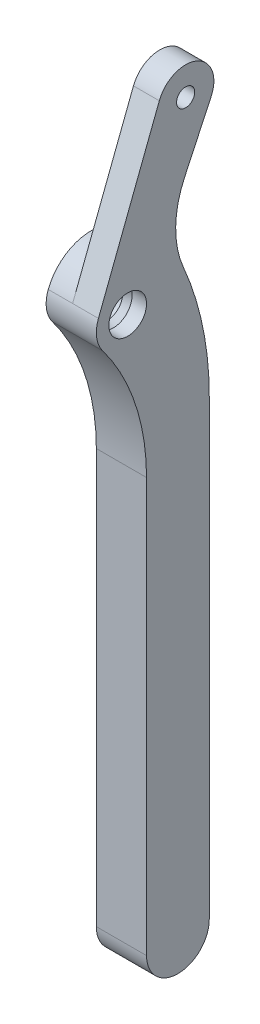
ISO-10303-21;
HEADER;
FILE_DESCRIPTION(('STEP AP214'),'2;1');
FILE_NAME('part.step','',(''),(''),'','','');
FILE_SCHEMA(('AUTOMOTIVE_DESIGN { 1 0 10303 214 1 1 1 1 }'));
ENDSEC;
DATA;
#1=APPLICATION_CONTEXT('core data for automotive mechanical design processes');
#2=APPLICATION_PROTOCOL_DEFINITION('international standard','automotive_design',2000,#1);
#3=PRODUCT_CONTEXT('',#1,'mechanical');
#4=PRODUCT('Part','Part','',(#3));
#5=PRODUCT_RELATED_PRODUCT_CATEGORY('part','',(#4));
#6=PRODUCT_DEFINITION_FORMATION('','',#4);
#7=PRODUCT_DEFINITION_CONTEXT('part definition',#1,'design');
#8=PRODUCT_DEFINITION('design','',#6,#7);
#9=PRODUCT_DEFINITION_SHAPE('','',#8);
#10=(LENGTH_UNIT() NAMED_UNIT(*) SI_UNIT(.MILLI.,.METRE.));
#11=(NAMED_UNIT(*) PLANE_ANGLE_UNIT() SI_UNIT($,.RADIAN.));
#12=(NAMED_UNIT(*) SI_UNIT($,.STERADIAN.) SOLID_ANGLE_UNIT());
#13=UNCERTAINTY_MEASURE_WITH_UNIT(LENGTH_MEASURE(1.E-05),#10,'distance_accuracy_value','');
#14=(GEOMETRIC_REPRESENTATION_CONTEXT(3) GLOBAL_UNCERTAINTY_ASSIGNED_CONTEXT((#13)) GLOBAL_UNIT_ASSIGNED_CONTEXT((#10,
#11,#12)) REPRESENTATION_CONTEXT('',''));
#15=CARTESIAN_POINT('',(0.,0.,0.));
#16=DIRECTION('',(0.,0.,1.));
#17=DIRECTION('',(1.,0.,0.));
#18=AXIS2_PLACEMENT_3D('',#15,#16,#17);
#19=CARTESIAN_POINT('',(-4.,0.,0.));
#20=DIRECTION('',(1.,0.,0.));
#21=DIRECTION('',(0.,0.,-1.));
#22=AXIS2_PLACEMENT_3D('',#19,#20,#21);
#23=PLANE('',#22);
#24=CARTESIAN_POINT('',(-4.,0.,0.));
#25=DIRECTION('',(1.,0.,0.));
#26=DIRECTION('',(0.,0.,-1.));
#27=AXIS2_PLACEMENT_3D('',#24,#25,#26);
#28=CIRCLE('',#27,3.);
#29=CARTESIAN_POINT('',(-4.,0.,-3.));
#30=VERTEX_POINT('',#29);
#31=EDGE_CURVE('E186',#30,#30,#28,.T.);
#32=ORIENTED_EDGE('',*,*,#31,.T.);
#33=EDGE_LOOP('',(#32));
#34=FACE_BOUND('',#33,.T.);
#35=CARTESIAN_POINT('',(-4.,-0.833359515232359,-2.16407586191516));
#36=DIRECTION('',(1.,0.,0.));
#37=DIRECTION('',(0.,0.,-1.));
#38=AXIS2_PLACEMENT_3D('',#35,#36,#37);
#39=CIRCLE('',#38,7.31898952514929);
#40=CARTESIAN_POINT('',(-4.,2.07598321337337,-8.87997733206451));
#41=VERTEX_POINT('',#40);
#42=CARTESIAN_POINT('',(-4.,1.79681604033703,4.66598886809512));
#43=VERTEX_POINT('',#42);
#44=EDGE_CURVE('E193',#41,#43,#39,.T.);
#45=ORIENTED_EDGE('',*,*,#44,.F.);
#46=CARTESIAN_POINT('',(-4.,-17.7993200549858,37.));
#47=DIRECTION('',(1.,0.,0.));
#48=DIRECTION('',(0.,0.,-1.));
#49=AXIS2_PLACEMENT_3D('',#46,#47,#48);
#50=CIRCLE('',#49,50.);
#51=CARTESIAN_POINT('',(-4.,-17.7993200549858,-13.));
#52=VERTEX_POINT('',#51);
#53=EDGE_CURVE('E155',#52,#41,#50,.T.);
#54=ORIENTED_EDGE('',*,*,#53,.F.);
#55=DIRECTION('',(0.,1.,0.));
#56=VECTOR('',#55,1.);
#57=CARTESIAN_POINT('',(-4.,0.,-13.));
#58=LINE('',#57,#56);
#59=CARTESIAN_POINT('',(-4.,-90.,-13.));
#60=VERTEX_POINT('',#59);
#61=EDGE_CURVE('E76',#60,#52,#58,.T.);
#62=ORIENTED_EDGE('',*,*,#61,.F.);
#63=CARTESIAN_POINT('',(-4.,-90.,-8.));
#64=DIRECTION('',(1.,0.,0.));
#65=DIRECTION('',(0.,0.,-1.));
#66=AXIS2_PLACEMENT_3D('',#63,#64,#65);
#67=CIRCLE('',#66,5.00000000000001);
#68=CARTESIAN_POINT('',(-4.,-90.,-3.));
#69=VERTEX_POINT('',#68);
#70=EDGE_CURVE('E152',#69,#60,#67,.T.);
#71=ORIENTED_EDGE('',*,*,#70,.F.);
#72=DIRECTION('',(0.,1.,0.));
#73=VECTOR('',#72,1.);
#74=CARTESIAN_POINT('',(-4.,0.,-3.));
#75=LINE('',#74,#73);
#76=CARTESIAN_POINT('',(-4.,-24.,-3.));
#77=VERTEX_POINT('',#76);
#78=EDGE_CURVE('E149',#69,#77,#75,.T.);
#79=ORIENTED_EDGE('',*,*,#78,.T.);
#80=CARTESIAN_POINT('',(-4.,-24.,32.));
#81=DIRECTION('',(1.,0.,0.));
#82=DIRECTION('',(0.,0.,-1.));
#83=AXIS2_PLACEMENT_3D('',#80,#81,#82);
#84=CIRCLE('',#83,35.);
#85=CARTESIAN_POINT('',(-4.,-3.,4.));
#86=VERTEX_POINT('',#85);
#87=EDGE_CURVE('E145',#77,#86,#84,.T.);
#88=ORIENTED_EDGE('',*,*,#87,.T.);
#89=CARTESIAN_POINT('',(-4.,0.,0.));
#90=DIRECTION('',(1.,0.,0.));
#91=DIRECTION('',(0.,0.,-1.));
#92=AXIS2_PLACEMENT_3D('',#89,#90,#91);
#93=CIRCLE('',#92,5.);
#94=EDGE_CURVE('E142',#43,#86,#93,.T.);
#95=ORIENTED_EDGE('',*,*,#94,.F.);
#96=EDGE_LOOP('',(#45,#54,#62,#71,#79,#88,#95));
#97=FACE_BOUND('',#96,.T.);
#98=ADVANCED_FACE('F35',(#34,#97),#23,.F.);
#99=CARTESIAN_POINT('',(4.,0.,0.));
#100=DIRECTION('',(-1.,0.,0.));
#101=DIRECTION('',(0.,0.,1.));
#102=AXIS2_PLACEMENT_3D('',#99,#100,#101);
#103=CYLINDRICAL_SURFACE('',#102,2.5);
#104=CARTESIAN_POINT('',(-1.7,0.,0.));
#105=DIRECTION('',(1.,0.,0.));
#106=DIRECTION('',(0.,0.,-1.));
#107=AXIS2_PLACEMENT_3D('',#104,#105,#106);
#108=CIRCLE('',#107,2.5);
#109=CARTESIAN_POINT('',(-1.7,0.,-2.5));
#110=VERTEX_POINT('',#109);
#111=EDGE_CURVE('E176',#110,#110,#108,.T.);
#112=ORIENTED_EDGE('',*,*,#111,.F.);
#113=EDGE_LOOP('',(#112));
#114=FACE_BOUND('',#113,.T.);
#115=CARTESIAN_POINT('',(0.7,0.,0.));
#116=DIRECTION('',(1.,0.,0.));
#117=DIRECTION('',(0.,0.,-1.));
#118=AXIS2_PLACEMENT_3D('',#115,#116,#117);
#119=CIRCLE('',#118,2.5);
#120=CARTESIAN_POINT('',(0.7,0.,-2.5));
#121=VERTEX_POINT('',#120);
#122=EDGE_CURVE('E146',#121,#121,#119,.T.);
#123=ORIENTED_EDGE('',*,*,#122,.T.);
#124=EDGE_LOOP('',(#123));
#125=FACE_BOUND('',#124,.T.);
#126=ADVANCED_FACE('F277',(#114,#125),#103,.F.);
#127=CARTESIAN_POINT('',(4.,25.3717007612195,-9.23454386979306));
#128=DIRECTION('',(-1.,0.,0.));
#129=DIRECTION('',(0.,0.,1.));
#130=AXIS2_PLACEMENT_3D('',#127,#128,#129);
#131=CYLINDRICAL_SURFACE('',#130,4.50000000000001);
#132=DIRECTION('',(-1.,0.,0.));
#133=VECTOR('',#132,1.);
#134=CARTESIAN_POINT('',(4.,23.4611174056779,-13.3088132817892));
#135=LINE('',#134,#133);
#136=CARTESIAN_POINT('',(4.,23.4611174056779,-13.3088132817892));
#137=VERTEX_POINT('',#136);
#138=CARTESIAN_POINT('',(-0.12,23.4611174056779,-13.3088132817892));
#139=VERTEX_POINT('',#138);
#140=EDGE_CURVE('E138',#137,#139,#135,.T.);
#141=ORIENTED_EDGE('',*,*,#140,.T.);
#142=CARTESIAN_POINT('',(-0.12,25.3717007612195,-9.23454386979306));
#143=DIRECTION('',(1.,0.,0.));
#144=DIRECTION('',(0.,0.,-1.));
#145=AXIS2_PLACEMENT_3D('',#142,#143,#144);
#146=CIRCLE('',#145,4.50000000000001);
#147=CARTESIAN_POINT('',(-0.12,26.9888351975228,-5.03515388850745));
#148=VERTEX_POINT('',#147);
#149=EDGE_CURVE('E200',#139,#148,#146,.T.);
#150=ORIENTED_EDGE('',*,*,#149,.T.);
#151=DIRECTION('',(-1.,0.,0.));
#152=VECTOR('',#151,1.);
#153=CARTESIAN_POINT('',(4.,26.9888351975228,-5.03515388850745));
#154=LINE('',#153,#152);
#155=CARTESIAN_POINT('',(4.,26.9888351975228,-5.03515388850745));
#156=VERTEX_POINT('',#155);
#157=EDGE_CURVE('E44',#156,#148,#154,.T.);
#158=ORIENTED_EDGE('',*,*,#157,.F.);
#159=CARTESIAN_POINT('',(4.,25.3717007612195,-9.23454386979306));
#160=DIRECTION('',(1.,0.,0.));
#161=DIRECTION('',(0.,0.,-1.));
#162=AXIS2_PLACEMENT_3D('',#159,#160,#161);
#163=CIRCLE('',#162,4.50000000000001);
#164=EDGE_CURVE('E216',#137,#156,#163,.T.);
#165=ORIENTED_EDGE('',*,*,#164,.F.);
#166=EDGE_LOOP('',(#141,#150,#158,#165));
#167=FACE_BOUND('',#166,.T.);
#168=ADVANCED_FACE('F258',(#167),#131,.T.);
#169=CARTESIAN_POINT('',(4.,1.79681604033703,4.66598886809512));
#170=DIRECTION('',(0.,-0.359363208067406,-0.933197773619024));
#171=DIRECTION('',(0.,0.933197773619024,-0.359363208067406));
#172=AXIS2_PLACEMENT_3D('',#169,#170,#171);
#173=PLANE('',#172);
#174=ORIENTED_EDGE('',*,*,#157,.T.);
#175=DIRECTION('',(0.,-0.933197773619024,0.359363208067406));
#176=VECTOR('',#175,1.);
#177=CARTESIAN_POINT('',(-0.12,1.79681604033703,4.66598886809512));
#178=LINE('',#177,#176);
#179=CARTESIAN_POINT('',(-0.12,1.79681604033703,4.66598886809512));
#180=VERTEX_POINT('',#179);
#181=EDGE_CURVE('E203',#148,#180,#178,.T.);
#182=ORIENTED_EDGE('',*,*,#181,.T.);
#183=DIRECTION('',(-1.,0.,0.));
#184=VECTOR('',#183,1.);
#185=CARTESIAN_POINT('',(4.,1.79681604033703,4.66598886809512));
#186=LINE('',#185,#184);
#187=CARTESIAN_POINT('',(4.,1.79681604033703,4.66598886809512));
#188=VERTEX_POINT('',#187);
#189=EDGE_CURVE('E170',#188,#180,#186,.T.);
#190=ORIENTED_EDGE('',*,*,#189,.F.);
#191=DIRECTION('',(0.,-0.933197773619024,0.359363208067406));
#192=VECTOR('',#191,1.);
#193=CARTESIAN_POINT('',(4.,1.79681604033703,4.66598886809512));
#194=LINE('',#193,#192);
#195=EDGE_CURVE('E93',#156,#188,#194,.T.);
#196=ORIENTED_EDGE('',*,*,#195,.F.);
#197=EDGE_LOOP('',(#174,#182,#190,#196));
#198=FACE_BOUND('',#197,.T.);
#199=ADVANCED_FACE('F247',(#198),#173,.F.);
#200=CARTESIAN_POINT('',(4.,0.,0.));
#201=DIRECTION('',(-1.,0.,0.));
#202=DIRECTION('',(0.,0.,1.));
#203=AXIS2_PLACEMENT_3D('',#200,#201,#202);
#204=CYLINDRICAL_SURFACE('',#203,5.);
#205=ORIENTED_EDGE('',*,*,#94,.T.);
#206=DIRECTION('',(-1.,0.,0.));
#207=VECTOR('',#206,1.);
#208=CARTESIAN_POINT('',(4.,-3.,4.));
#209=LINE('',#208,#207);
#210=CARTESIAN_POINT('',(4.,-3.,4.));
#211=VERTEX_POINT('',#210);
#212=EDGE_CURVE('E168',#211,#86,#209,.T.);
#213=ORIENTED_EDGE('',*,*,#212,.F.);
#214=CARTESIAN_POINT('',(4.,0.,0.));
#215=DIRECTION('',(1.,0.,0.));
#216=DIRECTION('',(0.,0.,-1.));
#217=AXIS2_PLACEMENT_3D('',#214,#215,#216);
#218=CIRCLE('',#217,5.);
#219=EDGE_CURVE('E219',#188,#211,#218,.T.);
#220=ORIENTED_EDGE('',*,*,#219,.F.);
#221=ORIENTED_EDGE('',*,*,#189,.T.);
#222=DIRECTION('',(1.,0.,0.));
#223=VECTOR('',#222,1.);
#224=CARTESIAN_POINT('',(-4.,1.79681604033703,4.66598886809512));
#225=LINE('',#224,#223);
#226=EDGE_CURVE('E208',#43,#180,#225,.T.);
#227=ORIENTED_EDGE('',*,*,#226,.F.);
#228=EDGE_LOOP('',(#205,#213,#220,#221,#227));
#229=FACE_BOUND('',#228,.T.);
#230=ADVANCED_FACE('F243',(#229),#204,.T.);
#231=CARTESIAN_POINT('',(4.,-24.,32.));
#232=DIRECTION('',(-1.,0.,0.));
#233=DIRECTION('',(0.,0.,1.));
#234=AXIS2_PLACEMENT_3D('',#231,#232,#233);
#235=CYLINDRICAL_SURFACE('',#234,35.);
#236=ORIENTED_EDGE('',*,*,#87,.F.);
#237=DIRECTION('',(-1.,0.,0.));
#238=VECTOR('',#237,1.);
#239=CARTESIAN_POINT('',(4.,-24.,-3.));
#240=LINE('',#239,#238);
#241=CARTESIAN_POINT('',(4.,-24.,-3.));
#242=VERTEX_POINT('',#241);
#243=EDGE_CURVE('E166',#242,#77,#240,.T.);
#244=ORIENTED_EDGE('',*,*,#243,.F.);
#245=CARTESIAN_POINT('',(4.,-24.,32.));
#246=DIRECTION('',(1.,0.,0.));
#247=DIRECTION('',(0.,0.,-1.));
#248=AXIS2_PLACEMENT_3D('',#245,#246,#247);
#249=CIRCLE('',#248,35.);
#250=EDGE_CURVE('E221',#242,#211,#249,.T.);
#251=ORIENTED_EDGE('',*,*,#250,.T.);
#252=ORIENTED_EDGE('',*,*,#212,.T.);
#253=EDGE_LOOP('',(#236,#244,#251,#252));
#254=FACE_BOUND('',#253,.T.);
#255=ADVANCED_FACE('F396',(#254),#235,.F.);
#256=CARTESIAN_POINT('',(4.,0.,-3.));
#257=DIRECTION('',(0.,0.,1.));
#258=DIRECTION('',(0.,-1.,0.));
#259=AXIS2_PLACEMENT_3D('',#256,#257,#258);
#260=PLANE('',#259);
#261=ORIENTED_EDGE('',*,*,#78,.F.);
#262=DIRECTION('',(-1.,0.,0.));
#263=VECTOR('',#262,1.);
#264=CARTESIAN_POINT('',(4.,-90.,-3.));
#265=LINE('',#264,#263);
#266=CARTESIAN_POINT('',(4.,-90.,-3.));
#267=VERTEX_POINT('',#266);
#268=EDGE_CURVE('E164',#267,#69,#265,.T.);
#269=ORIENTED_EDGE('',*,*,#268,.F.);
#270=DIRECTION('',(0.,1.,0.));
#271=VECTOR('',#270,1.);
#272=CARTESIAN_POINT('',(4.,0.,-3.));
#273=LINE('',#272,#271);
#274=EDGE_CURVE('E224',#267,#242,#273,.T.);
#275=ORIENTED_EDGE('',*,*,#274,.T.);
#276=ORIENTED_EDGE('',*,*,#243,.T.);
#277=EDGE_LOOP('',(#261,#269,#275,#276));
#278=FACE_BOUND('',#277,.T.);
#279=ADVANCED_FACE('F434',(#278),#260,.T.);
#280=CARTESIAN_POINT('',(4.,-90.,-8.));
#281=DIRECTION('',(-1.,0.,0.));
#282=DIRECTION('',(0.,0.,1.));
#283=AXIS2_PLACEMENT_3D('',#280,#281,#282);
#284=CYLINDRICAL_SURFACE('',#283,5.00000000000001);
#285=ORIENTED_EDGE('',*,*,#70,.T.);
#286=DIRECTION('',(-1.,0.,0.));
#287=VECTOR('',#286,1.);
#288=CARTESIAN_POINT('',(4.,-90.,-13.));
#289=LINE('',#288,#287);
#290=CARTESIAN_POINT('',(4.,-90.,-13.));
#291=VERTEX_POINT('',#290);
#292=EDGE_CURVE('E162',#291,#60,#289,.T.);
#293=ORIENTED_EDGE('',*,*,#292,.F.);
#294=CARTESIAN_POINT('',(4.,-90.,-8.));
#295=DIRECTION('',(1.,0.,0.));
#296=DIRECTION('',(0.,0.,-1.));
#297=AXIS2_PLACEMENT_3D('',#294,#295,#296);
#298=CIRCLE('',#297,5.00000000000001);
#299=EDGE_CURVE('E227',#267,#291,#298,.T.);
#300=ORIENTED_EDGE('',*,*,#299,.F.);
#301=ORIENTED_EDGE('',*,*,#268,.T.);
#302=EDGE_LOOP('',(#285,#293,#300,#301));
#303=FACE_BOUND('',#302,.T.);
#304=ADVANCED_FACE('F233',(#303),#284,.T.);
#305=CARTESIAN_POINT('',(4.,0.,-13.));
#306=DIRECTION('',(0.,0.,1.));
#307=DIRECTION('',(0.,-1.,0.));
#308=AXIS2_PLACEMENT_3D('',#305,#306,#307);
#309=PLANE('',#308);
#310=ORIENTED_EDGE('',*,*,#61,.T.);
#311=DIRECTION('',(-1.,0.,0.));
#312=VECTOR('',#311,1.);
#313=CARTESIAN_POINT('',(4.,-17.7993200549858,-13.));
#314=LINE('',#313,#312);
#315=CARTESIAN_POINT('',(4.,-17.7993200549858,-13.));
#316=VERTEX_POINT('',#315);
#317=EDGE_CURVE('E132',#316,#52,#314,.T.);
#318=ORIENTED_EDGE('',*,*,#317,.F.);
#319=DIRECTION('',(0.,1.,0.));
#320=VECTOR('',#319,1.);
#321=CARTESIAN_POINT('',(4.,0.,-13.));
#322=LINE('',#321,#320);
#323=EDGE_CURVE('E122',#291,#316,#322,.T.);
#324=ORIENTED_EDGE('',*,*,#323,.F.);
#325=ORIENTED_EDGE('',*,*,#292,.T.);
#326=EDGE_LOOP('',(#310,#318,#324,#325));
#327=FACE_BOUND('',#326,.T.);
#328=ADVANCED_FACE('F235',(#327),#309,.F.);
#329=CARTESIAN_POINT('',(4.,-17.7993200549858,37.));
#330=DIRECTION('',(-1.,0.,0.));
#331=DIRECTION('',(0.,0.,1.));
#332=AXIS2_PLACEMENT_3D('',#329,#330,#331);
#333=CYLINDRICAL_SURFACE('',#332,50.);
#334=ORIENTED_EDGE('',*,*,#53,.T.);
#335=DIRECTION('',(1.,0.,0.));
#336=VECTOR('',#335,1.);
#337=CARTESIAN_POINT('',(-4.,2.07598321337337,-8.87997733206451));
#338=LINE('',#337,#336);
#339=CARTESIAN_POINT('',(-0.12,2.07598321337337,-8.87997733206451));
#340=VERTEX_POINT('',#339);
#341=EDGE_CURVE('E84',#41,#340,#338,.T.);
#342=ORIENTED_EDGE('',*,*,#341,.T.);
#343=DIRECTION('',(-1.,0.,0.));
#344=VECTOR('',#343,1.);
#345=CARTESIAN_POINT('',(4.,2.07598321337337,-8.87997733206451));
#346=LINE('',#345,#344);
#347=CARTESIAN_POINT('',(4.,2.07598321337337,-8.87997733206451));
#348=VERTEX_POINT('',#347);
#349=EDGE_CURVE('E126',#348,#340,#346,.T.);
#350=ORIENTED_EDGE('',*,*,#349,.F.);
#351=CARTESIAN_POINT('',(4.,-17.7993200549858,37.));
#352=DIRECTION('',(1.,0.,0.));
#353=DIRECTION('',(0.,0.,-1.));
#354=AXIS2_PLACEMENT_3D('',#351,#352,#353);
#355=CIRCLE('',#354,50.);
#356=EDGE_CURVE('E115',#316,#348,#355,.T.);
#357=ORIENTED_EDGE('',*,*,#356,.F.);
#358=ORIENTED_EDGE('',*,*,#317,.T.);
#359=EDGE_LOOP('',(#334,#342,#350,#357,#358));
#360=FACE_BOUND('',#359,.T.);
#361=ADVANCED_FACE('F128',(#360),#333,.T.);
#362=CARTESIAN_POINT('',(4.,8.03857419388111,-22.6439705316838));
#363=DIRECTION('',(-1.,0.,0.));
#364=DIRECTION('',(0.,0.,1.));
#365=AXIS2_PLACEMENT_3D('',#362,#363,#364);
#366=CYLINDRICAL_SURFACE('',#365,15.);
#367=ORIENTED_EDGE('',*,*,#349,.T.);
#368=CARTESIAN_POINT('',(-0.12,8.03857419388111,-22.6439705316838));
#369=DIRECTION('',(1.,0.,0.));
#370=DIRECTION('',(0.,0.,-1.));
#371=AXIS2_PLACEMENT_3D('',#368,#369,#370);
#372=CIRCLE('',#371,15.);
#373=CARTESIAN_POINT('',(-0.12,14.4071853790198,-9.06307249169672));
#374=VERTEX_POINT('',#373);
#375=EDGE_CURVE('E183',#340,#374,#372,.F.);
#376=ORIENTED_EDGE('',*,*,#375,.T.);
#377=DIRECTION('',(-1.,0.,0.));
#378=VECTOR('',#377,1.);
#379=CARTESIAN_POINT('',(4.,14.4071853790198,-9.06307249169672));
#380=LINE('',#379,#378);
#381=CARTESIAN_POINT('',(4.,14.4071853790198,-9.06307249169672));
#382=VERTEX_POINT('',#381);
#383=EDGE_CURVE('E133',#382,#374,#380,.T.);
#384=ORIENTED_EDGE('',*,*,#383,.F.);
#385=CARTESIAN_POINT('',(4.,8.03857419388111,-22.6439705316838));
#386=DIRECTION('',(1.,0.,0.));
#387=DIRECTION('',(0.,0.,-1.));
#388=AXIS2_PLACEMENT_3D('',#385,#386,#387);
#389=CIRCLE('',#388,15.);
#390=EDGE_CURVE('E119',#348,#382,#389,.F.);
#391=ORIENTED_EDGE('',*,*,#390,.F.);
#392=EDGE_LOOP('',(#367,#376,#384,#391));
#393=FACE_BOUND('',#392,.T.);
#394=ADVANCED_FACE('F135',(#393),#366,.F.);
#395=CARTESIAN_POINT('',(4.,-0.88681924290714,-1.89111901601481));
#396=DIRECTION('',(0.,0.424574079009247,0.905393202665808));
#397=DIRECTION('',(0.,-0.905393202665808,0.424574079009247));
#398=AXIS2_PLACEMENT_3D('',#395,#396,#397);
#399=PLANE('',#398);
#400=ORIENTED_EDGE('',*,*,#383,.T.);
#401=DIRECTION('',(0.,0.905393202665808,-0.424574079009247));
#402=VECTOR('',#401,1.);
#403=CARTESIAN_POINT('',(-0.12,-0.88681924290714,-1.89111901601481));
#404=LINE('',#403,#402);
#405=EDGE_CURVE('E197',#374,#139,#404,.T.);
#406=ORIENTED_EDGE('',*,*,#405,.T.);
#407=ORIENTED_EDGE('',*,*,#140,.F.);
#408=DIRECTION('',(0.,0.905393202665808,-0.424574079009247));
#409=VECTOR('',#408,1.);
#410=CARTESIAN_POINT('',(4.,-0.88681924290714,-1.89111901601481));
#411=LINE('',#410,#409);
#412=EDGE_CURVE('E52',#382,#137,#411,.T.);
#413=ORIENTED_EDGE('',*,*,#412,.F.);
#414=EDGE_LOOP('',(#400,#406,#407,#413));
#415=FACE_BOUND('',#414,.T.);
#416=ADVANCED_FACE('F263',(#415),#399,.F.);
#417=CARTESIAN_POINT('',(4.,25.3717007612195,-9.23454386979306));
#418=DIRECTION('',(-1.,0.,0.));
#419=DIRECTION('',(0.,0.,1.));
#420=AXIS2_PLACEMENT_3D('',#417,#418,#419);
#421=CYLINDRICAL_SURFACE('',#420,1.45000000000001);
#422=CARTESIAN_POINT('',(-0.12,25.3717007612195,-9.23454386979306));
#423=DIRECTION('',(1.,0.,0.));
#424=DIRECTION('',(0.,0.,-1.));
#425=AXIS2_PLACEMENT_3D('',#422,#423,#424);
#426=CIRCLE('',#425,1.45000000000001);
#427=CARTESIAN_POINT('',(-0.12,25.3717007612195,-10.6845438697931));
#428=VERTEX_POINT('',#427);
#429=EDGE_CURVE('E194',#428,#428,#426,.T.);
#430=ORIENTED_EDGE('',*,*,#429,.F.);
#431=EDGE_LOOP('',(#430));
#432=FACE_BOUND('',#431,.T.);
#433=CARTESIAN_POINT('',(4.,25.3717007612195,-9.23454386979306));
#434=DIRECTION('',(1.,0.,0.));
#435=DIRECTION('',(0.,0.,-1.));
#436=AXIS2_PLACEMENT_3D('',#433,#434,#435);
#437=CIRCLE('',#436,1.45000000000001);
#438=CARTESIAN_POINT('',(4.,25.3717007612195,-10.6845438697931));
#439=VERTEX_POINT('',#438);
#440=EDGE_CURVE('E157',#439,#439,#437,.T.);
#441=ORIENTED_EDGE('',*,*,#440,.T.);
#442=EDGE_LOOP('',(#441));
#443=FACE_BOUND('',#442,.T.);
#444=ADVANCED_FACE('F267',(#432,#443),#421,.F.);
#445=CARTESIAN_POINT('',(4.,0.,0.));
#446=DIRECTION('',(1.,0.,0.));
#447=DIRECTION('',(0.,0.,-1.));
#448=AXIS2_PLACEMENT_3D('',#445,#446,#447);
#449=PLANE('',#448);
#450=CARTESIAN_POINT('',(4.,0.,0.));
#451=DIRECTION('',(1.,0.,0.));
#452=DIRECTION('',(0.,0.,-1.));
#453=AXIS2_PLACEMENT_3D('',#450,#451,#452);
#454=CIRCLE('',#453,3.);
#455=CARTESIAN_POINT('',(4.,0.,-3.));
#456=VERTEX_POINT('',#455);
#457=EDGE_CURVE('E175',#456,#456,#454,.T.);
#458=ORIENTED_EDGE('',*,*,#457,.F.);
#459=EDGE_LOOP('',(#458));
#460=FACE_BOUND('',#459,.T.);
#461=ORIENTED_EDGE('',*,*,#440,.F.);
#462=EDGE_LOOP('',(#461));
#463=FACE_BOUND('',#462,.T.);
#464=ORIENTED_EDGE('',*,*,#164,.T.);
#465=ORIENTED_EDGE('',*,*,#195,.T.);
#466=ORIENTED_EDGE('',*,*,#219,.T.);
#467=ORIENTED_EDGE('',*,*,#250,.F.);
#468=ORIENTED_EDGE('',*,*,#274,.F.);
#469=ORIENTED_EDGE('',*,*,#299,.T.);
#470=ORIENTED_EDGE('',*,*,#323,.T.);
#471=ORIENTED_EDGE('',*,*,#356,.T.);
#472=ORIENTED_EDGE('',*,*,#390,.T.);
#473=ORIENTED_EDGE('',*,*,#412,.T.);
#474=EDGE_LOOP('',(#464,#465,#466,#467,#468,#469,#470,#471,#472,#473));
#475=FACE_BOUND('',#474,.T.);
#476=ADVANCED_FACE('F117',(#460,#463,#475),#449,.T.);
#477=CARTESIAN_POINT('',(0.7,0.,0.));
#478=DIRECTION('',(1.,0.,0.));
#479=DIRECTION('',(0.,0.,-1.));
#480=AXIS2_PLACEMENT_3D('',#477,#478,#479);
#481=CYLINDRICAL_SURFACE('',#480,3.);
#482=CARTESIAN_POINT('',(1.69999999999999,0.,0.));
#483=DIRECTION('',(1.,0.,0.));
#484=DIRECTION('',(0.,0.,-1.));
#485=AXIS2_PLACEMENT_3D('',#482,#483,#484);
#486=CIRCLE('',#485,3.);
#487=CARTESIAN_POINT('',(1.69999999999999,0.,-3.));
#488=VERTEX_POINT('',#487);
#489=EDGE_CURVE('E11',#488,#488,#486,.F.);
#490=ORIENTED_EDGE('',*,*,#489,.T.);
#491=EDGE_LOOP('',(#490));
#492=FACE_BOUND('',#491,.T.);
#493=ORIENTED_EDGE('',*,*,#457,.T.);
#494=EDGE_LOOP('',(#493));
#495=FACE_BOUND('',#494,.T.);
#496=ADVANCED_FACE('F287',(#492,#495),#481,.F.);
#497=CARTESIAN_POINT('',(-4.,-0.833359515232359,-2.16407586191516));
#498=DIRECTION('',(1.,0.,0.));
#499=DIRECTION('',(0.,0.,-1.));
#500=AXIS2_PLACEMENT_3D('',#497,#498,#499);
#501=CYLINDRICAL_SURFACE('',#500,7.31898952514929);
#502=CARTESIAN_POINT('',(-0.12,-0.833359515232359,-2.16407586191516));
#503=DIRECTION('',(1.,0.,0.));
#504=DIRECTION('',(0.,0.,-1.));
#505=AXIS2_PLACEMENT_3D('',#502,#503,#504);
#506=CIRCLE('',#505,7.31898952514929);
#507=EDGE_CURVE('E178',#340,#180,#506,.T.);
#508=ORIENTED_EDGE('',*,*,#507,.F.);
#509=ORIENTED_EDGE('',*,*,#341,.F.);
#510=ORIENTED_EDGE('',*,*,#44,.T.);
#511=ORIENTED_EDGE('',*,*,#226,.T.);
#512=EDGE_LOOP('',(#508,#509,#510,#511));
#513=FACE_BOUND('',#512,.T.);
#514=ADVANCED_FACE('F240',(#513),#501,.T.);
#515=CARTESIAN_POINT('',(-0.12,0.,0.));
#516=DIRECTION('',(1.,0.,0.));
#517=DIRECTION('',(0.,0.,-1.));
#518=AXIS2_PLACEMENT_3D('',#515,#516,#517);
#519=PLANE('',#518);
#520=ORIENTED_EDGE('',*,*,#507,.T.);
#521=ORIENTED_EDGE('',*,*,#181,.F.);
#522=ORIENTED_EDGE('',*,*,#149,.F.);
#523=ORIENTED_EDGE('',*,*,#405,.F.);
#524=ORIENTED_EDGE('',*,*,#375,.F.);
#525=EDGE_LOOP('',(#520,#521,#522,#523,#524));
#526=FACE_BOUND('',#525,.T.);
#527=ORIENTED_EDGE('',*,*,#429,.T.);
#528=EDGE_LOOP('',(#527));
#529=FACE_BOUND('',#528,.T.);
#530=ADVANCED_FACE('F252',(#526,#529),#519,.F.);
#531=CARTESIAN_POINT('',(-1.7,0.,0.));
#532=DIRECTION('',(-1.,0.,0.));
#533=DIRECTION('',(0.,0.,1.));
#534=AXIS2_PLACEMENT_3D('',#531,#532,#533);
#535=CYLINDRICAL_SURFACE('',#534,3.);
#536=CARTESIAN_POINT('',(-1.7,0.,0.));
#537=DIRECTION('',(1.,0.,0.));
#538=DIRECTION('',(0.,0.,-1.));
#539=AXIS2_PLACEMENT_3D('',#536,#537,#538);
#540=CIRCLE('',#539,3.);
#541=CARTESIAN_POINT('',(-1.7,0.,-3.));
#542=VERTEX_POINT('',#541);
#543=EDGE_CURVE('E179',#542,#542,#540,.T.);
#544=ORIENTED_EDGE('',*,*,#543,.T.);
#545=EDGE_LOOP('',(#544));
#546=FACE_BOUND('',#545,.T.);
#547=ORIENTED_EDGE('',*,*,#31,.F.);
#548=EDGE_LOOP('',(#547));
#549=FACE_BOUND('',#548,.T.);
#550=ADVANCED_FACE('F296',(#546,#549),#535,.F.);
#551=CARTESIAN_POINT('',(-1.7,0.,0.));
#552=DIRECTION('',(1.,0.,0.));
#553=DIRECTION('',(0.,0.,-1.));
#554=AXIS2_PLACEMENT_3D('',#551,#552,#553);
#555=PLANE('',#554);
#556=ORIENTED_EDGE('',*,*,#111,.T.);
#557=EDGE_LOOP('',(#556));
#558=FACE_BOUND('',#557,.T.);
#559=ORIENTED_EDGE('',*,*,#543,.F.);
#560=EDGE_LOOP('',(#559));
#561=FACE_BOUND('',#560,.T.);
#562=ADVANCED_FACE('F299',(#558,#561),#555,.F.);
#563=CARTESIAN_POINT('',(0.7,0.,0.));
#564=DIRECTION('',(1.,0.,0.));
#565=DIRECTION('',(0.,0.,-1.));
#566=AXIS2_PLACEMENT_3D('',#563,#564,#565);
#567=CONICAL_SURFACE('',#566,2.5,0.463647609000813);
#568=ORIENTED_EDGE('',*,*,#489,.F.);
#569=EDGE_LOOP('',(#568));
#570=FACE_BOUND('',#569,.T.);
#571=ORIENTED_EDGE('',*,*,#122,.F.);
#572=EDGE_LOOP('',(#571));
#573=FACE_BOUND('',#572,.T.);
#574=ADVANCED_FACE('F37',(#570,#573),#567,.F.);
#575=CLOSED_SHELL('',(#98,#126,#168,#199,#230,#255,#279,#304,#328,#361,#394,#416,#444,#476,#496,
#514,#530,#550,#562,#574));
#576=MANIFOLD_SOLID_BREP('B2',#575);
#577=ADVANCED_BREP_SHAPE_REPRESENTATION('',(#18,#576),#14);
#578=SHAPE_DEFINITION_REPRESENTATION(#9,#577);
ENDSEC;
END-ISO-10303-21;
